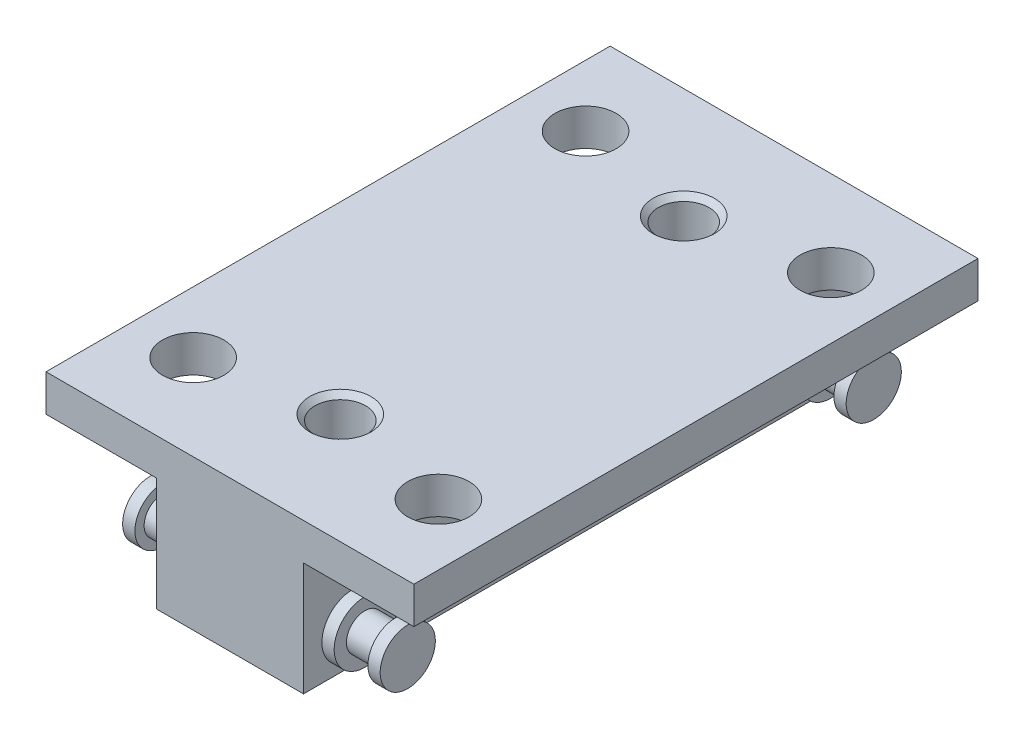
ISO-10303-21;
HEADER;
FILE_DESCRIPTION(('STEP AP214'),'2;1');
FILE_NAME('part.step','',(''),(''),'','','');
FILE_SCHEMA(('AUTOMOTIVE_DESIGN { 1 0 10303 214 1 1 1 1 }'));
ENDSEC;
DATA;
#1=APPLICATION_CONTEXT('core data for automotive mechanical design processes');
#2=APPLICATION_PROTOCOL_DEFINITION('international standard','automotive_design',2000,#1);
#3=PRODUCT_CONTEXT('',#1,'mechanical');
#4=PRODUCT('Part','Part','',(#3));
#5=PRODUCT_RELATED_PRODUCT_CATEGORY('part','',(#4));
#6=PRODUCT_DEFINITION_FORMATION('','',#4);
#7=PRODUCT_DEFINITION_CONTEXT('part definition',#1,'design');
#8=PRODUCT_DEFINITION('design','',#6,#7);
#9=PRODUCT_DEFINITION_SHAPE('','',#8);
#10=(LENGTH_UNIT() NAMED_UNIT(*) SI_UNIT(.MILLI.,.METRE.));
#11=(NAMED_UNIT(*) PLANE_ANGLE_UNIT() SI_UNIT($,.RADIAN.));
#12=(NAMED_UNIT(*) SI_UNIT($,.STERADIAN.) SOLID_ANGLE_UNIT());
#13=UNCERTAINTY_MEASURE_WITH_UNIT(LENGTH_MEASURE(1.E-05),#10,'distance_accuracy_value','');
#14=(GEOMETRIC_REPRESENTATION_CONTEXT(3) GLOBAL_UNCERTAINTY_ASSIGNED_CONTEXT((#13)) GLOBAL_UNIT_ASSIGNED_CONTEXT((#10,
#11,#12)) REPRESENTATION_CONTEXT('',''));
#15=CARTESIAN_POINT('',(0.,0.,0.));
#16=DIRECTION('',(0.,0.,1.));
#17=DIRECTION('',(1.,0.,0.));
#18=AXIS2_PLACEMENT_3D('',#15,#16,#17);
#19=CARTESIAN_POINT('',(15.,6.25,23.));
#20=DIRECTION('',(0.,-1.,0.));
#21=DIRECTION('',(0.,0.,-1.));
#22=AXIS2_PLACEMENT_3D('',#19,#20,#21);
#23=PLANE('',#22);
#24=CARTESIAN_POINT('',(10.,6.25,16.));
#25=DIRECTION('',(0.,1.,0.));
#26=DIRECTION('',(0.,0.,1.));
#27=AXIS2_PLACEMENT_3D('',#24,#25,#26);
#28=CIRCLE('',#27,2.5);
#29=CARTESIAN_POINT('',(10.,6.25,18.5));
#30=VERTEX_POINT('',#29);
#31=EDGE_CURVE('E206',#30,#30,#28,.T.);
#32=ORIENTED_EDGE('',*,*,#31,.F.);
#33=EDGE_LOOP('',(#32));
#34=FACE_BOUND('',#33,.T.);
#35=CARTESIAN_POINT('',(-10.,6.25,16.));
#36=DIRECTION('',(0.,1.,0.));
#37=DIRECTION('',(0.,0.,1.));
#38=AXIS2_PLACEMENT_3D('',#35,#36,#37);
#39=CIRCLE('',#38,2.5);
#40=CARTESIAN_POINT('',(-10.,6.25,18.5));
#41=VERTEX_POINT('',#40);
#42=EDGE_CURVE('E210',#41,#41,#39,.T.);
#43=ORIENTED_EDGE('',*,*,#42,.F.);
#44=EDGE_LOOP('',(#43));
#45=FACE_BOUND('',#44,.T.);
#46=CARTESIAN_POINT('',(10.,6.25,-16.));
#47=DIRECTION('',(0.,1.,0.));
#48=DIRECTION('',(0.,0.,1.));
#49=AXIS2_PLACEMENT_3D('',#46,#47,#48);
#50=CIRCLE('',#49,2.5);
#51=CARTESIAN_POINT('',(10.,6.25,-13.5));
#52=VERTEX_POINT('',#51);
#53=EDGE_CURVE('E214',#52,#52,#50,.T.);
#54=ORIENTED_EDGE('',*,*,#53,.F.);
#55=EDGE_LOOP('',(#54));
#56=FACE_BOUND('',#55,.T.);
#57=CARTESIAN_POINT('',(-10.,6.25,-16.));
#58=DIRECTION('',(0.,1.,0.));
#59=DIRECTION('',(0.,0.,1.));
#60=AXIS2_PLACEMENT_3D('',#57,#58,#59);
#61=CIRCLE('',#60,2.5);
#62=CARTESIAN_POINT('',(-10.,6.25,-13.5));
#63=VERTEX_POINT('',#62);
#64=EDGE_CURVE('E218',#63,#63,#61,.T.);
#65=ORIENTED_EDGE('',*,*,#64,.F.);
#66=EDGE_LOOP('',(#65));
#67=FACE_BOUND('',#66,.T.);
#68=CARTESIAN_POINT('',(0.,6.25,14.));
#69=DIRECTION('',(0.,1.,0.));
#70=DIRECTION('',(0.,0.,1.));
#71=AXIS2_PLACEMENT_3D('',#68,#69,#70);
#72=CIRCLE('',#71,2.5);
#73=CARTESIAN_POINT('',(0.,6.25,16.5));
#74=VERTEX_POINT('',#73);
#75=EDGE_CURVE('E221',#74,#74,#72,.T.);
#76=ORIENTED_EDGE('',*,*,#75,.F.);
#77=EDGE_LOOP('',(#76));
#78=FACE_BOUND('',#77,.T.);
#79=DIRECTION('',(0.,0.,-1.));
#80=VECTOR('',#79,1.);
#81=CARTESIAN_POINT('',(15.,6.25,23.));
#82=LINE('',#81,#80);
#83=CARTESIAN_POINT('',(15.,6.25,23.));
#84=VERTEX_POINT('',#83);
#85=CARTESIAN_POINT('',(15.,6.25,-23.));
#86=VERTEX_POINT('',#85);
#87=EDGE_CURVE('E122',#84,#86,#82,.T.);
#88=ORIENTED_EDGE('',*,*,#87,.T.);
#89=DIRECTION('',(-1.,0.,0.));
#90=VECTOR('',#89,1.);
#91=CARTESIAN_POINT('',(15.,6.25,-23.));
#92=LINE('',#91,#90);
#93=CARTESIAN_POINT('',(-15.,6.25,-23.));
#94=VERTEX_POINT('',#93);
#95=EDGE_CURVE('E115',#86,#94,#92,.T.);
#96=ORIENTED_EDGE('',*,*,#95,.T.);
#97=DIRECTION('',(0.,0.,-1.));
#98=VECTOR('',#97,1.);
#99=CARTESIAN_POINT('',(-15.,6.25,23.));
#100=LINE('',#99,#98);
#101=CARTESIAN_POINT('',(-15.,6.25,23.));
#102=VERTEX_POINT('',#101);
#103=EDGE_CURVE('E98',#102,#94,#100,.T.);
#104=ORIENTED_EDGE('',*,*,#103,.F.);
#105=DIRECTION('',(-1.,0.,0.));
#106=VECTOR('',#105,1.);
#107=CARTESIAN_POINT('',(15.,6.25,23.));
#108=LINE('',#107,#106);
#109=EDGE_CURVE('E145',#84,#102,#108,.T.);
#110=ORIENTED_EDGE('',*,*,#109,.F.);
#111=EDGE_LOOP('',(#88,#96,#104,#110));
#112=FACE_BOUND('',#111,.T.);
#113=CARTESIAN_POINT('',(0.,6.25,-14.));
#114=DIRECTION('',(0.,1.,0.));
#115=DIRECTION('',(0.,0.,1.));
#116=AXIS2_PLACEMENT_3D('',#113,#114,#115);
#117=CIRCLE('',#116,2.5);
#118=CARTESIAN_POINT('',(0.,6.25,-11.5));
#119=VERTEX_POINT('',#118);
#120=EDGE_CURVE('E657',#119,#119,#117,.T.);
#121=ORIENTED_EDGE('',*,*,#120,.F.);
#122=EDGE_LOOP('',(#121));
#123=FACE_BOUND('',#122,.T.);
#124=ADVANCED_FACE('F34',(#34,#45,#56,#67,#78,#112,#123),#23,.F.);
#125=CARTESIAN_POINT('',(-6.,-6.,23.));
#126=DIRECTION('',(0.,1.,0.));
#127=DIRECTION('',(0.,0.,1.));
#128=AXIS2_PLACEMENT_3D('',#125,#126,#127);
#129=PLANE('',#128);
#130=CARTESIAN_POINT('',(0.,-6.,14.));
#131=DIRECTION('',(0.,1.,0.));
#132=DIRECTION('',(0.,0.,1.));
#133=AXIS2_PLACEMENT_3D('',#130,#131,#132);
#134=CIRCLE('',#133,2.5);
#135=CARTESIAN_POINT('',(0.,-6.,16.5));
#136=VERTEX_POINT('',#135);
#137=EDGE_CURVE('E660',#136,#136,#134,.T.);
#138=ORIENTED_EDGE('',*,*,#137,.T.);
#139=EDGE_LOOP('',(#138));
#140=FACE_BOUND('',#139,.T.);
#141=DIRECTION('',(0.,0.,-1.));
#142=VECTOR('',#141,1.);
#143=CARTESIAN_POINT('',(-6.,-6.,23.));
#144=LINE('',#143,#142);
#145=CARTESIAN_POINT('',(-6.,-6.,23.));
#146=VERTEX_POINT('',#145);
#147=CARTESIAN_POINT('',(-6.,-6.,-23.));
#148=VERTEX_POINT('',#147);
#149=EDGE_CURVE('E165',#146,#148,#144,.T.);
#150=ORIENTED_EDGE('',*,*,#149,.T.);
#151=DIRECTION('',(1.,0.,0.));
#152=VECTOR('',#151,1.);
#153=CARTESIAN_POINT('',(-6.,-6.,-23.));
#154=LINE('',#153,#152);
#155=CARTESIAN_POINT('',(6.,-6.,-23.));
#156=VERTEX_POINT('',#155);
#157=EDGE_CURVE('E134',#148,#156,#154,.T.);
#158=ORIENTED_EDGE('',*,*,#157,.T.);
#159=DIRECTION('',(0.,0.,-1.));
#160=VECTOR('',#159,1.);
#161=CARTESIAN_POINT('',(6.,-6.,23.));
#162=LINE('',#161,#160);
#163=CARTESIAN_POINT('',(6.,-6.,23.));
#164=VERTEX_POINT('',#163);
#165=EDGE_CURVE('E163',#164,#156,#162,.T.);
#166=ORIENTED_EDGE('',*,*,#165,.F.);
#167=DIRECTION('',(1.,0.,0.));
#168=VECTOR('',#167,1.);
#169=CARTESIAN_POINT('',(-6.,-6.,23.));
#170=LINE('',#169,#168);
#171=EDGE_CURVE('E152',#146,#164,#170,.T.);
#172=ORIENTED_EDGE('',*,*,#171,.F.);
#173=EDGE_LOOP('',(#150,#158,#166,#172));
#174=FACE_BOUND('',#173,.T.);
#175=CARTESIAN_POINT('',(0.,-6.,-14.));
#176=DIRECTION('',(0.,1.,0.));
#177=DIRECTION('',(0.,0.,1.));
#178=AXIS2_PLACEMENT_3D('',#175,#176,#177);
#179=CIRCLE('',#178,2.5);
#180=CARTESIAN_POINT('',(0.,-6.,-11.5));
#181=VERTEX_POINT('',#180);
#182=EDGE_CURVE('E648',#181,#181,#179,.T.);
#183=ORIENTED_EDGE('',*,*,#182,.T.);
#184=EDGE_LOOP('',(#183));
#185=FACE_BOUND('',#184,.T.);
#186=ADVANCED_FACE('F189',(#140,#174,#185),#129,.F.);
#187=CARTESIAN_POINT('',(-6.,3.25,23.));
#188=DIRECTION('',(1.,0.,0.));
#189=DIRECTION('',(0.,0.,-1.));
#190=AXIS2_PLACEMENT_3D('',#187,#188,#189);
#191=PLANE('',#190);
#192=CARTESIAN_POINT('',(-6.,-3.125,19.));
#193=DIRECTION('',(1.,0.,0.));
#194=DIRECTION('',(0.,0.,-1.));
#195=AXIS2_PLACEMENT_3D('',#192,#193,#194);
#196=CIRCLE('',#195,2.5);
#197=CARTESIAN_POINT('',(-6.,-3.125,16.5));
#198=VERTEX_POINT('',#197);
#199=EDGE_CURVE('E172',#198,#198,#196,.F.);
#200=ORIENTED_EDGE('',*,*,#199,.F.);
#201=EDGE_LOOP('',(#200));
#202=FACE_BOUND('',#201,.T.);
#203=DIRECTION('',(0.,0.,-1.));
#204=VECTOR('',#203,1.);
#205=CARTESIAN_POINT('',(-6.,3.25,23.));
#206=LINE('',#205,#204);
#207=CARTESIAN_POINT('',(-6.,3.25,23.));
#208=VERTEX_POINT('',#207);
#209=CARTESIAN_POINT('',(-6.,3.25,-23.));
#210=VERTEX_POINT('',#209);
#211=EDGE_CURVE('E167',#208,#210,#206,.T.);
#212=ORIENTED_EDGE('',*,*,#211,.T.);
#213=DIRECTION('',(0.,-1.,0.));
#214=VECTOR('',#213,1.);
#215=CARTESIAN_POINT('',(-6.,3.25,-23.));
#216=LINE('',#215,#214);
#217=EDGE_CURVE('E131',#210,#148,#216,.T.);
#218=ORIENTED_EDGE('',*,*,#217,.T.);
#219=ORIENTED_EDGE('',*,*,#149,.F.);
#220=DIRECTION('',(0.,-1.,0.));
#221=VECTOR('',#220,1.);
#222=CARTESIAN_POINT('',(-6.,3.25,23.));
#223=LINE('',#222,#221);
#224=EDGE_CURVE('E150',#208,#146,#223,.T.);
#225=ORIENTED_EDGE('',*,*,#224,.F.);
#226=EDGE_LOOP('',(#212,#218,#219,#225));
#227=FACE_BOUND('',#226,.T.);
#228=CARTESIAN_POINT('',(-6.,-3.125,-19.));
#229=DIRECTION('',(1.,0.,0.));
#230=DIRECTION('',(0.,0.,-1.));
#231=AXIS2_PLACEMENT_3D('',#228,#229,#230);
#232=CIRCLE('',#231,2.5);
#233=CARTESIAN_POINT('',(-6.,-3.125,-21.5));
#234=VERTEX_POINT('',#233);
#235=EDGE_CURVE('E11',#234,#234,#232,.F.);
#236=ORIENTED_EDGE('',*,*,#235,.F.);
#237=EDGE_LOOP('',(#236));
#238=FACE_BOUND('',#237,.T.);
#239=ADVANCED_FACE('F181',(#202,#227,#238),#191,.F.);
#240=CARTESIAN_POINT('',(6.,-6.,23.));
#241=DIRECTION('',(-1.,0.,0.));
#242=DIRECTION('',(0.,0.,1.));
#243=AXIS2_PLACEMENT_3D('',#240,#241,#242);
#244=PLANE('',#243);
#245=ORIENTED_EDGE('',*,*,#165,.T.);
#246=DIRECTION('',(0.,1.,0.));
#247=VECTOR('',#246,1.);
#248=CARTESIAN_POINT('',(6.,-6.,-23.));
#249=LINE('',#248,#247);
#250=CARTESIAN_POINT('',(6.,3.25,-23.));
#251=VERTEX_POINT('',#250);
#252=EDGE_CURVE('E137',#156,#251,#249,.T.);
#253=ORIENTED_EDGE('',*,*,#252,.T.);
#254=DIRECTION('',(0.,0.,-1.));
#255=VECTOR('',#254,1.);
#256=CARTESIAN_POINT('',(6.,3.25,23.));
#257=LINE('',#256,#255);
#258=CARTESIAN_POINT('',(6.,3.25,23.));
#259=VERTEX_POINT('',#258);
#260=EDGE_CURVE('E161',#259,#251,#257,.T.);
#261=ORIENTED_EDGE('',*,*,#260,.F.);
#262=DIRECTION('',(0.,1.,0.));
#263=VECTOR('',#262,1.);
#264=CARTESIAN_POINT('',(6.,-6.,23.));
#265=LINE('',#264,#263);
#266=EDGE_CURVE('E154',#164,#259,#265,.T.);
#267=ORIENTED_EDGE('',*,*,#266,.F.);
#268=EDGE_LOOP('',(#245,#253,#261,#267));
#269=FACE_BOUND('',#268,.T.);
#270=CARTESIAN_POINT('',(6.,-3.125,19.));
#271=DIRECTION('',(-1.,0.,0.));
#272=DIRECTION('',(0.,0.,1.));
#273=AXIS2_PLACEMENT_3D('',#270,#271,#272);
#274=CIRCLE('',#273,2.5);
#275=CARTESIAN_POINT('',(6.,-3.125,21.5));
#276=VERTEX_POINT('',#275);
#277=EDGE_CURVE('E107',#276,#276,#274,.F.);
#278=ORIENTED_EDGE('',*,*,#277,.F.);
#279=EDGE_LOOP('',(#278));
#280=FACE_BOUND('',#279,.T.);
#281=CARTESIAN_POINT('',(6.,-3.125,-19.));
#282=DIRECTION('',(-1.,0.,0.));
#283=DIRECTION('',(0.,0.,1.));
#284=AXIS2_PLACEMENT_3D('',#281,#282,#283);
#285=CIRCLE('',#284,2.5);
#286=CARTESIAN_POINT('',(6.,-3.125,-16.5));
#287=VERTEX_POINT('',#286);
#288=EDGE_CURVE('E41',#287,#287,#285,.F.);
#289=ORIENTED_EDGE('',*,*,#288,.F.);
#290=EDGE_LOOP('',(#289));
#291=FACE_BOUND('',#290,.T.);
#292=ADVANCED_FACE('F179',(#269,#280,#291),#244,.F.);
#293=CARTESIAN_POINT('',(-15.,6.25,23.));
#294=DIRECTION('',(1.,0.,0.));
#295=DIRECTION('',(0.,0.,-1.));
#296=AXIS2_PLACEMENT_3D('',#293,#294,#295);
#297=PLANE('',#296);
#298=ORIENTED_EDGE('',*,*,#103,.T.);
#299=DIRECTION('',(0.,-1.,0.));
#300=VECTOR('',#299,1.);
#301=CARTESIAN_POINT('',(-15.,6.25,-23.));
#302=LINE('',#301,#300);
#303=CARTESIAN_POINT('',(-15.,3.25,-23.));
#304=VERTEX_POINT('',#303);
#305=EDGE_CURVE('E102',#94,#304,#302,.T.);
#306=ORIENTED_EDGE('',*,*,#305,.T.);
#307=DIRECTION('',(0.,0.,-1.));
#308=VECTOR('',#307,1.);
#309=CARTESIAN_POINT('',(-15.,3.25,23.));
#310=LINE('',#309,#308);
#311=CARTESIAN_POINT('',(-15.,3.25,23.));
#312=VERTEX_POINT('',#311);
#313=EDGE_CURVE('E108',#312,#304,#310,.T.);
#314=ORIENTED_EDGE('',*,*,#313,.F.);
#315=DIRECTION('',(0.,-1.,0.));
#316=VECTOR('',#315,1.);
#317=CARTESIAN_POINT('',(-15.,6.25,23.));
#318=LINE('',#317,#316);
#319=EDGE_CURVE('E103',#102,#312,#318,.T.);
#320=ORIENTED_EDGE('',*,*,#319,.F.);
#321=EDGE_LOOP('',(#298,#306,#314,#320));
#322=FACE_BOUND('',#321,.T.);
#323=ADVANCED_FACE('F100',(#322),#297,.F.);
#324=CARTESIAN_POINT('',(-15.,3.25,23.));
#325=DIRECTION('',(0.,1.,0.));
#326=DIRECTION('',(0.,0.,1.));
#327=AXIS2_PLACEMENT_3D('',#324,#325,#326);
#328=PLANE('',#327);
#329=CARTESIAN_POINT('',(-10.,3.25,16.));
#330=DIRECTION('',(0.,1.,0.));
#331=DIRECTION('',(0.,0.,1.));
#332=AXIS2_PLACEMENT_3D('',#329,#330,#331);
#333=CIRCLE('',#332,2.5);
#334=CARTESIAN_POINT('',(-10.,3.25,18.5));
#335=VERTEX_POINT('',#334);
#336=EDGE_CURVE('E639',#335,#335,#333,.F.);
#337=ORIENTED_EDGE('',*,*,#336,.F.);
#338=EDGE_LOOP('',(#337));
#339=FACE_BOUND('',#338,.T.);
#340=CARTESIAN_POINT('',(-10.,3.25,-16.));
#341=DIRECTION('',(0.,1.,0.));
#342=DIRECTION('',(0.,0.,1.));
#343=AXIS2_PLACEMENT_3D('',#340,#341,#342);
#344=CIRCLE('',#343,2.5);
#345=CARTESIAN_POINT('',(-10.,3.25,-13.5));
#346=VERTEX_POINT('',#345);
#347=EDGE_CURVE('E645',#346,#346,#344,.F.);
#348=ORIENTED_EDGE('',*,*,#347,.F.);
#349=EDGE_LOOP('',(#348));
#350=FACE_BOUND('',#349,.T.);
#351=ORIENTED_EDGE('',*,*,#313,.T.);
#352=DIRECTION('',(1.,0.,0.));
#353=VECTOR('',#352,1.);
#354=CARTESIAN_POINT('',(-15.,3.25,-23.));
#355=LINE('',#354,#353);
#356=EDGE_CURVE('E119',#304,#210,#355,.T.);
#357=ORIENTED_EDGE('',*,*,#356,.T.);
#358=ORIENTED_EDGE('',*,*,#211,.F.);
#359=DIRECTION('',(1.,0.,0.));
#360=VECTOR('',#359,1.);
#361=CARTESIAN_POINT('',(-15.,3.25,23.));
#362=LINE('',#361,#360);
#363=EDGE_CURVE('E148',#312,#208,#362,.T.);
#364=ORIENTED_EDGE('',*,*,#363,.F.);
#365=EDGE_LOOP('',(#351,#357,#358,#364));
#366=FACE_BOUND('',#365,.T.);
#367=ADVANCED_FACE('F188',(#339,#350,#366),#328,.F.);
#368=CARTESIAN_POINT('',(6.,3.25,23.));
#369=DIRECTION('',(0.,1.,0.));
#370=DIRECTION('',(0.,0.,1.));
#371=AXIS2_PLACEMENT_3D('',#368,#369,#370);
#372=PLANE('',#371);
#373=CARTESIAN_POINT('',(10.,3.25,16.));
#374=DIRECTION('',(0.,1.,0.));
#375=DIRECTION('',(0.,0.,1.));
#376=AXIS2_PLACEMENT_3D('',#373,#374,#375);
#377=CIRCLE('',#376,2.5);
#378=CARTESIAN_POINT('',(10.,3.25,18.5));
#379=VERTEX_POINT('',#378);
#380=EDGE_CURVE('E346',#379,#379,#377,.F.);
#381=ORIENTED_EDGE('',*,*,#380,.F.);
#382=EDGE_LOOP('',(#381));
#383=FACE_BOUND('',#382,.T.);
#384=CARTESIAN_POINT('',(10.,3.25,-16.));
#385=DIRECTION('',(0.,1.,0.));
#386=DIRECTION('',(0.,0.,1.));
#387=AXIS2_PLACEMENT_3D('',#384,#385,#386);
#388=CIRCLE('',#387,2.5);
#389=CARTESIAN_POINT('',(10.,3.25,-13.5));
#390=VERTEX_POINT('',#389);
#391=EDGE_CURVE('E350',#390,#390,#388,.F.);
#392=ORIENTED_EDGE('',*,*,#391,.F.);
#393=EDGE_LOOP('',(#392));
#394=FACE_BOUND('',#393,.T.);
#395=ORIENTED_EDGE('',*,*,#260,.T.);
#396=DIRECTION('',(1.,0.,0.));
#397=VECTOR('',#396,1.);
#398=CARTESIAN_POINT('',(6.,3.25,-23.));
#399=LINE('',#398,#397);
#400=CARTESIAN_POINT('',(15.,3.25,-23.));
#401=VERTEX_POINT('',#400);
#402=EDGE_CURVE('E140',#251,#401,#399,.T.);
#403=ORIENTED_EDGE('',*,*,#402,.T.);
#404=DIRECTION('',(0.,0.,-1.));
#405=VECTOR('',#404,1.);
#406=CARTESIAN_POINT('',(15.,3.25,23.));
#407=LINE('',#406,#405);
#408=CARTESIAN_POINT('',(15.,3.25,23.));
#409=VERTEX_POINT('',#408);
#410=EDGE_CURVE('E159',#409,#401,#407,.T.);
#411=ORIENTED_EDGE('',*,*,#410,.F.);
#412=DIRECTION('',(1.,0.,0.));
#413=VECTOR('',#412,1.);
#414=CARTESIAN_POINT('',(6.,3.25,23.));
#415=LINE('',#414,#413);
#416=EDGE_CURVE('E53',#259,#409,#415,.T.);
#417=ORIENTED_EDGE('',*,*,#416,.F.);
#418=EDGE_LOOP('',(#395,#403,#411,#417));
#419=FACE_BOUND('',#418,.T.);
#420=ADVANCED_FACE('F334',(#383,#394,#419),#372,.F.);
#421=CARTESIAN_POINT('',(15.,3.25,23.));
#422=DIRECTION('',(-1.,0.,0.));
#423=DIRECTION('',(0.,0.,1.));
#424=AXIS2_PLACEMENT_3D('',#421,#422,#423);
#425=PLANE('',#424);
#426=ORIENTED_EDGE('',*,*,#410,.T.);
#427=DIRECTION('',(0.,1.,0.));
#428=VECTOR('',#427,1.);
#429=CARTESIAN_POINT('',(15.,3.25,-23.));
#430=LINE('',#429,#428);
#431=EDGE_CURVE('E143',#401,#86,#430,.T.);
#432=ORIENTED_EDGE('',*,*,#431,.T.);
#433=ORIENTED_EDGE('',*,*,#87,.F.);
#434=DIRECTION('',(0.,1.,0.));
#435=VECTOR('',#434,1.);
#436=CARTESIAN_POINT('',(15.,3.25,23.));
#437=LINE('',#436,#435);
#438=EDGE_CURVE('E48',#409,#84,#437,.T.);
#439=ORIENTED_EDGE('',*,*,#438,.F.);
#440=EDGE_LOOP('',(#426,#432,#433,#439));
#441=FACE_BOUND('',#440,.T.);
#442=ADVANCED_FACE('F332',(#441),#425,.F.);
#443=CARTESIAN_POINT('',(0.,0.,23.));
#444=DIRECTION('',(0.,0.,1.));
#445=DIRECTION('',(1.,0.,0.));
#446=AXIS2_PLACEMENT_3D('',#443,#444,#445);
#447=PLANE('',#446);
#448=ORIENTED_EDGE('',*,*,#109,.T.);
#449=ORIENTED_EDGE('',*,*,#319,.T.);
#450=ORIENTED_EDGE('',*,*,#363,.T.);
#451=ORIENTED_EDGE('',*,*,#224,.T.);
#452=ORIENTED_EDGE('',*,*,#171,.T.);
#453=ORIENTED_EDGE('',*,*,#266,.T.);
#454=ORIENTED_EDGE('',*,*,#416,.T.);
#455=ORIENTED_EDGE('',*,*,#438,.T.);
#456=EDGE_LOOP('',(#448,#449,#450,#451,#452,#453,#454,#455));
#457=FACE_BOUND('',#456,.T.);
#458=ADVANCED_FACE('F329',(#457),#447,.T.);
#459=CARTESIAN_POINT('',(0.,0.,-23.));
#460=DIRECTION('',(0.,0.,1.));
#461=DIRECTION('',(1.,0.,0.));
#462=AXIS2_PLACEMENT_3D('',#459,#460,#461);
#463=PLANE('',#462);
#464=ORIENTED_EDGE('',*,*,#95,.F.);
#465=ORIENTED_EDGE('',*,*,#431,.F.);
#466=ORIENTED_EDGE('',*,*,#402,.F.);
#467=ORIENTED_EDGE('',*,*,#252,.F.);
#468=ORIENTED_EDGE('',*,*,#157,.F.);
#469=ORIENTED_EDGE('',*,*,#217,.F.);
#470=ORIENTED_EDGE('',*,*,#356,.F.);
#471=ORIENTED_EDGE('',*,*,#305,.F.);
#472=EDGE_LOOP('',(#464,#465,#466,#467,#468,#469,#470,#471));
#473=FACE_BOUND('',#472,.T.);
#474=ADVANCED_FACE('F113',(#473),#463,.F.);
#475=CARTESIAN_POINT('',(10.5,-3.125,19.));
#476=DIRECTION('',(-1.,0.,0.));
#477=DIRECTION('',(0.,0.,1.));
#478=AXIS2_PLACEMENT_3D('',#475,#476,#477);
#479=PLANE('',#478);
#480=CARTESIAN_POINT('',(10.5,-3.125,19.));
#481=DIRECTION('',(1.,0.,0.));
#482=DIRECTION('',(0.,0.,-1.));
#483=AXIS2_PLACEMENT_3D('',#480,#481,#482);
#484=CIRCLE('',#483,2.25);
#485=CARTESIAN_POINT('',(10.5,-3.125,16.75));
#486=VERTEX_POINT('',#485);
#487=EDGE_CURVE('E123',#486,#486,#484,.T.);
#488=ORIENTED_EDGE('',*,*,#487,.T.);
#489=EDGE_LOOP('',(#488));
#490=FACE_BOUND('',#489,.T.);
#491=ADVANCED_FACE('F322',(#490),#479,.F.);
#492=CARTESIAN_POINT('',(-10.5,-3.125,19.));
#493=DIRECTION('',(1.,0.,0.));
#494=DIRECTION('',(0.,0.,-1.));
#495=AXIS2_PLACEMENT_3D('',#492,#493,#494);
#496=CYLINDRICAL_SURFACE('',#495,2.25);
#497=ORIENTED_EDGE('',*,*,#487,.F.);
#498=EDGE_LOOP('',(#497));
#499=FACE_BOUND('',#498,.T.);
#500=CARTESIAN_POINT('',(9.5,-3.125,19.));
#501=DIRECTION('',(1.,0.,0.));
#502=DIRECTION('',(0.,0.,-1.));
#503=AXIS2_PLACEMENT_3D('',#500,#501,#502);
#504=CIRCLE('',#503,2.25);
#505=CARTESIAN_POINT('',(9.5,-3.125,16.75));
#506=VERTEX_POINT('',#505);
#507=EDGE_CURVE('E126',#506,#506,#504,.T.);
#508=ORIENTED_EDGE('',*,*,#507,.T.);
#509=EDGE_LOOP('',(#508));
#510=FACE_BOUND('',#509,.T.);
#511=ADVANCED_FACE('F286',(#499,#510),#496,.T.);
#512=CARTESIAN_POINT('',(9.5,-5.375,19.));
#513=DIRECTION('',(1.,0.,0.));
#514=DIRECTION('',(0.,0.,-1.));
#515=AXIS2_PLACEMENT_3D('',#512,#513,#514);
#516=PLANE('',#515);
#517=ORIENTED_EDGE('',*,*,#507,.F.);
#518=EDGE_LOOP('',(#517));
#519=FACE_BOUND('',#518,.T.);
#520=CARTESIAN_POINT('',(9.5,-3.125,19.));
#521=DIRECTION('',(1.,0.,0.));
#522=DIRECTION('',(0.,0.,-1.));
#523=AXIS2_PLACEMENT_3D('',#520,#521,#522);
#524=CIRCLE('',#523,1.5);
#525=CARTESIAN_POINT('',(9.5,-3.125,17.5));
#526=VERTEX_POINT('',#525);
#527=EDGE_CURVE('E281',#526,#526,#524,.T.);
#528=ORIENTED_EDGE('',*,*,#527,.T.);
#529=EDGE_LOOP('',(#528));
#530=FACE_BOUND('',#529,.T.);
#531=ADVANCED_FACE('F288',(#519,#530),#516,.F.);
#532=CARTESIAN_POINT('',(-10.5,-3.125,19.));
#533=DIRECTION('',(1.,0.,0.));
#534=DIRECTION('',(0.,0.,-1.));
#535=AXIS2_PLACEMENT_3D('',#532,#533,#534);
#536=CYLINDRICAL_SURFACE('',#535,1.5);
#537=ORIENTED_EDGE('',*,*,#527,.F.);
#538=EDGE_LOOP('',(#537));
#539=FACE_BOUND('',#538,.T.);
#540=CARTESIAN_POINT('',(7.,-3.125,19.));
#541=DIRECTION('',(1.,0.,0.));
#542=DIRECTION('',(0.,0.,-1.));
#543=AXIS2_PLACEMENT_3D('',#540,#541,#542);
#544=CIRCLE('',#543,1.5);
#545=CARTESIAN_POINT('',(7.,-3.125,17.5));
#546=VERTEX_POINT('',#545);
#547=EDGE_CURVE('E278',#546,#546,#544,.T.);
#548=ORIENTED_EDGE('',*,*,#547,.T.);
#549=EDGE_LOOP('',(#548));
#550=FACE_BOUND('',#549,.T.);
#551=ADVANCED_FACE('F291',(#539,#550),#536,.T.);
#552=CARTESIAN_POINT('',(7.,-4.625,19.));
#553=DIRECTION('',(-1.,0.,0.));
#554=DIRECTION('',(0.,0.,1.));
#555=AXIS2_PLACEMENT_3D('',#552,#553,#554);
#556=PLANE('',#555);
#557=ORIENTED_EDGE('',*,*,#547,.F.);
#558=EDGE_LOOP('',(#557));
#559=FACE_BOUND('',#558,.T.);
#560=CARTESIAN_POINT('',(7.,-3.125,19.));
#561=DIRECTION('',(1.,0.,0.));
#562=DIRECTION('',(0.,0.,-1.));
#563=AXIS2_PLACEMENT_3D('',#560,#561,#562);
#564=CIRCLE('',#563,2.5);
#565=CARTESIAN_POINT('',(7.,-3.125,16.5));
#566=VERTEX_POINT('',#565);
#567=EDGE_CURVE('E275',#566,#566,#564,.T.);
#568=ORIENTED_EDGE('',*,*,#567,.T.);
#569=EDGE_LOOP('',(#568));
#570=FACE_BOUND('',#569,.T.);
#571=ADVANCED_FACE('F297',(#559,#570),#556,.F.);
#572=CARTESIAN_POINT('',(-10.5,-3.125,19.));
#573=DIRECTION('',(1.,0.,0.));
#574=DIRECTION('',(0.,0.,-1.));
#575=AXIS2_PLACEMENT_3D('',#572,#573,#574);
#576=CYLINDRICAL_SURFACE('',#575,2.5);
#577=ORIENTED_EDGE('',*,*,#567,.F.);
#578=EDGE_LOOP('',(#577));
#579=FACE_BOUND('',#578,.T.);
#580=ORIENTED_EDGE('',*,*,#277,.T.);
#581=EDGE_LOOP('',(#580));
#582=FACE_BOUND('',#581,.T.);
#583=ADVANCED_FACE('F303',(#579,#582),#576,.T.);
#584=CARTESIAN_POINT('',(-10.5,-3.125,19.));
#585=DIRECTION('',(1.,0.,0.));
#586=DIRECTION('',(0.,0.,-1.));
#587=AXIS2_PLACEMENT_3D('',#584,#585,#586);
#588=CYLINDRICAL_SURFACE('',#587,2.5);
#589=ORIENTED_EDGE('',*,*,#199,.T.);
#590=EDGE_LOOP('',(#589));
#591=FACE_BOUND('',#590,.T.);
#592=CARTESIAN_POINT('',(-7.,-3.125,19.));
#593=DIRECTION('',(1.,0.,0.));
#594=DIRECTION('',(0.,0.,-1.));
#595=AXIS2_PLACEMENT_3D('',#592,#593,#594);
#596=CIRCLE('',#595,2.5);
#597=CARTESIAN_POINT('',(-7.,-3.125,16.5));
#598=VERTEX_POINT('',#597);
#599=EDGE_CURVE('E272',#598,#598,#596,.T.);
#600=ORIENTED_EDGE('',*,*,#599,.T.);
#601=EDGE_LOOP('',(#600));
#602=FACE_BOUND('',#601,.T.);
#603=ADVANCED_FACE('F309',(#591,#602),#588,.T.);
#604=CARTESIAN_POINT('',(-7.,-5.625,19.));
#605=DIRECTION('',(1.,0.,0.));
#606=DIRECTION('',(0.,0.,-1.));
#607=AXIS2_PLACEMENT_3D('',#604,#605,#606);
#608=PLANE('',#607);
#609=ORIENTED_EDGE('',*,*,#599,.F.);
#610=EDGE_LOOP('',(#609));
#611=FACE_BOUND('',#610,.T.);
#612=CARTESIAN_POINT('',(-7.,-3.125,19.));
#613=DIRECTION('',(1.,0.,0.));
#614=DIRECTION('',(0.,0.,-1.));
#615=AXIS2_PLACEMENT_3D('',#612,#613,#614);
#616=CIRCLE('',#615,1.5);
#617=CARTESIAN_POINT('',(-7.,-3.125,17.5));
#618=VERTEX_POINT('',#617);
#619=EDGE_CURVE('E269',#618,#618,#616,.T.);
#620=ORIENTED_EDGE('',*,*,#619,.T.);
#621=EDGE_LOOP('',(#620));
#622=FACE_BOUND('',#621,.T.);
#623=ADVANCED_FACE('F315',(#611,#622),#608,.F.);
#624=CARTESIAN_POINT('',(-10.5,-3.125,19.));
#625=DIRECTION('',(1.,0.,0.));
#626=DIRECTION('',(0.,0.,-1.));
#627=AXIS2_PLACEMENT_3D('',#624,#625,#626);
#628=CYLINDRICAL_SURFACE('',#627,1.5);
#629=ORIENTED_EDGE('',*,*,#619,.F.);
#630=EDGE_LOOP('',(#629));
#631=FACE_BOUND('',#630,.T.);
#632=CARTESIAN_POINT('',(-9.5,-3.125,19.));
#633=DIRECTION('',(1.,0.,0.));
#634=DIRECTION('',(0.,0.,-1.));
#635=AXIS2_PLACEMENT_3D('',#632,#633,#634);
#636=CIRCLE('',#635,1.5);
#637=CARTESIAN_POINT('',(-9.5,-3.125,17.5));
#638=VERTEX_POINT('',#637);
#639=EDGE_CURVE('E266',#638,#638,#636,.T.);
#640=ORIENTED_EDGE('',*,*,#639,.T.);
#641=EDGE_LOOP('',(#640));
#642=FACE_BOUND('',#641,.T.);
#643=ADVANCED_FACE('F444',(#631,#642),#628,.T.);
#644=CARTESIAN_POINT('',(-9.5,-4.625,19.));
#645=DIRECTION('',(-1.,0.,0.));
#646=DIRECTION('',(0.,0.,1.));
#647=AXIS2_PLACEMENT_3D('',#644,#645,#646);
#648=PLANE('',#647);
#649=ORIENTED_EDGE('',*,*,#639,.F.);
#650=EDGE_LOOP('',(#649));
#651=FACE_BOUND('',#650,.T.);
#652=CARTESIAN_POINT('',(-9.5,-3.125,19.));
#653=DIRECTION('',(1.,0.,0.));
#654=DIRECTION('',(0.,0.,-1.));
#655=AXIS2_PLACEMENT_3D('',#652,#653,#654);
#656=CIRCLE('',#655,2.25);
#657=CARTESIAN_POINT('',(-9.5,-3.125,16.75));
#658=VERTEX_POINT('',#657);
#659=EDGE_CURVE('E263',#658,#658,#656,.T.);
#660=ORIENTED_EDGE('',*,*,#659,.T.);
#661=EDGE_LOOP('',(#660));
#662=FACE_BOUND('',#661,.T.);
#663=ADVANCED_FACE('F440',(#651,#662),#648,.F.);
#664=CARTESIAN_POINT('',(-10.5,-3.125,19.));
#665=DIRECTION('',(1.,0.,0.));
#666=DIRECTION('',(0.,0.,-1.));
#667=AXIS2_PLACEMENT_3D('',#664,#665,#666);
#668=CYLINDRICAL_SURFACE('',#667,2.25);
#669=ORIENTED_EDGE('',*,*,#659,.F.);
#670=EDGE_LOOP('',(#669));
#671=FACE_BOUND('',#670,.T.);
#672=CARTESIAN_POINT('',(-10.5,-3.125,19.));
#673=DIRECTION('',(1.,0.,0.));
#674=DIRECTION('',(0.,0.,-1.));
#675=AXIS2_PLACEMENT_3D('',#672,#673,#674);
#676=CIRCLE('',#675,2.25);
#677=CARTESIAN_POINT('',(-10.5,-3.125,16.75));
#678=VERTEX_POINT('',#677);
#679=EDGE_CURVE('E260',#678,#678,#676,.T.);
#680=ORIENTED_EDGE('',*,*,#679,.T.);
#681=EDGE_LOOP('',(#680));
#682=FACE_BOUND('',#681,.T.);
#683=ADVANCED_FACE('F436',(#671,#682),#668,.T.);
#684=CARTESIAN_POINT('',(-10.5,-5.375,19.));
#685=DIRECTION('',(1.,0.,0.));
#686=DIRECTION('',(0.,0.,-1.));
#687=AXIS2_PLACEMENT_3D('',#684,#685,#686);
#688=PLANE('',#687);
#689=ORIENTED_EDGE('',*,*,#679,.F.);
#690=EDGE_LOOP('',(#689));
#691=FACE_BOUND('',#690,.T.);
#692=ADVANCED_FACE('F432',(#691),#688,.F.);
#693=CARTESIAN_POINT('',(10.5,-3.125,-19.));
#694=DIRECTION('',(-1.,0.,0.));
#695=DIRECTION('',(0.,0.,1.));
#696=AXIS2_PLACEMENT_3D('',#693,#694,#695);
#697=PLANE('',#696);
#698=CARTESIAN_POINT('',(10.5,-3.125,-19.));
#699=DIRECTION('',(1.,0.,0.));
#700=DIRECTION('',(0.,0.,-1.));
#701=AXIS2_PLACEMENT_3D('',#698,#699,#700);
#702=CIRCLE('',#701,2.25);
#703=CARTESIAN_POINT('',(10.5,-3.125,-21.25));
#704=VERTEX_POINT('',#703);
#705=EDGE_CURVE('E257',#704,#704,#702,.T.);
#706=ORIENTED_EDGE('',*,*,#705,.T.);
#707=EDGE_LOOP('',(#706));
#708=FACE_BOUND('',#707,.T.);
#709=ADVANCED_FACE('F428',(#708),#697,.F.);
#710=CARTESIAN_POINT('',(-10.5,-3.125,-19.));
#711=DIRECTION('',(1.,0.,0.));
#712=DIRECTION('',(0.,0.,-1.));
#713=AXIS2_PLACEMENT_3D('',#710,#711,#712);
#714=CYLINDRICAL_SURFACE('',#713,2.25);
#715=ORIENTED_EDGE('',*,*,#705,.F.);
#716=EDGE_LOOP('',(#715));
#717=FACE_BOUND('',#716,.T.);
#718=CARTESIAN_POINT('',(9.5,-3.125,-19.));
#719=DIRECTION('',(1.,0.,0.));
#720=DIRECTION('',(0.,0.,-1.));
#721=AXIS2_PLACEMENT_3D('',#718,#719,#720);
#722=CIRCLE('',#721,2.25);
#723=CARTESIAN_POINT('',(9.5,-3.125,-21.25));
#724=VERTEX_POINT('',#723);
#725=EDGE_CURVE('E254',#724,#724,#722,.T.);
#726=ORIENTED_EDGE('',*,*,#725,.T.);
#727=EDGE_LOOP('',(#726));
#728=FACE_BOUND('',#727,.T.);
#729=ADVANCED_FACE('F424',(#717,#728),#714,.T.);
#730=CARTESIAN_POINT('',(9.5,-5.375,-19.));
#731=DIRECTION('',(1.,0.,0.));
#732=DIRECTION('',(0.,0.,-1.));
#733=AXIS2_PLACEMENT_3D('',#730,#731,#732);
#734=PLANE('',#733);
#735=ORIENTED_EDGE('',*,*,#725,.F.);
#736=EDGE_LOOP('',(#735));
#737=FACE_BOUND('',#736,.T.);
#738=CARTESIAN_POINT('',(9.5,-3.125,-19.));
#739=DIRECTION('',(1.,0.,0.));
#740=DIRECTION('',(0.,0.,-1.));
#741=AXIS2_PLACEMENT_3D('',#738,#739,#740);
#742=CIRCLE('',#741,1.5);
#743=CARTESIAN_POINT('',(9.5,-3.125,-20.5));
#744=VERTEX_POINT('',#743);
#745=EDGE_CURVE('E251',#744,#744,#742,.T.);
#746=ORIENTED_EDGE('',*,*,#745,.T.);
#747=EDGE_LOOP('',(#746));
#748=FACE_BOUND('',#747,.T.);
#749=ADVANCED_FACE('F420',(#737,#748),#734,.F.);
#750=CARTESIAN_POINT('',(-10.5,-3.125,-19.));
#751=DIRECTION('',(1.,0.,0.));
#752=DIRECTION('',(0.,0.,-1.));
#753=AXIS2_PLACEMENT_3D('',#750,#751,#752);
#754=CYLINDRICAL_SURFACE('',#753,1.5);
#755=ORIENTED_EDGE('',*,*,#745,.F.);
#756=EDGE_LOOP('',(#755));
#757=FACE_BOUND('',#756,.T.);
#758=CARTESIAN_POINT('',(7.,-3.125,-19.));
#759=DIRECTION('',(1.,0.,0.));
#760=DIRECTION('',(0.,0.,-1.));
#761=AXIS2_PLACEMENT_3D('',#758,#759,#760);
#762=CIRCLE('',#761,1.5);
#763=CARTESIAN_POINT('',(7.,-3.125,-20.5));
#764=VERTEX_POINT('',#763);
#765=EDGE_CURVE('E248',#764,#764,#762,.T.);
#766=ORIENTED_EDGE('',*,*,#765,.T.);
#767=EDGE_LOOP('',(#766));
#768=FACE_BOUND('',#767,.T.);
#769=ADVANCED_FACE('F416',(#757,#768),#754,.T.);
#770=CARTESIAN_POINT('',(7.,-4.625,-19.));
#771=DIRECTION('',(-1.,0.,0.));
#772=DIRECTION('',(0.,0.,1.));
#773=AXIS2_PLACEMENT_3D('',#770,#771,#772);
#774=PLANE('',#773);
#775=ORIENTED_EDGE('',*,*,#765,.F.);
#776=EDGE_LOOP('',(#775));
#777=FACE_BOUND('',#776,.T.);
#778=CARTESIAN_POINT('',(7.,-3.125,-19.));
#779=DIRECTION('',(1.,0.,0.));
#780=DIRECTION('',(0.,0.,-1.));
#781=AXIS2_PLACEMENT_3D('',#778,#779,#780);
#782=CIRCLE('',#781,2.5);
#783=CARTESIAN_POINT('',(7.,-3.125,-21.5));
#784=VERTEX_POINT('',#783);
#785=EDGE_CURVE('E245',#784,#784,#782,.T.);
#786=ORIENTED_EDGE('',*,*,#785,.T.);
#787=EDGE_LOOP('',(#786));
#788=FACE_BOUND('',#787,.T.);
#789=ADVANCED_FACE('F412',(#777,#788),#774,.F.);
#790=CARTESIAN_POINT('',(-10.5,-3.125,-19.));
#791=DIRECTION('',(1.,0.,0.));
#792=DIRECTION('',(0.,0.,-1.));
#793=AXIS2_PLACEMENT_3D('',#790,#791,#792);
#794=CYLINDRICAL_SURFACE('',#793,2.5);
#795=ORIENTED_EDGE('',*,*,#785,.F.);
#796=EDGE_LOOP('',(#795));
#797=FACE_BOUND('',#796,.T.);
#798=ORIENTED_EDGE('',*,*,#288,.T.);
#799=EDGE_LOOP('',(#798));
#800=FACE_BOUND('',#799,.T.);
#801=ADVANCED_FACE('F177',(#797,#800),#794,.T.);
#802=CARTESIAN_POINT('',(-10.5,-3.125,-19.));
#803=DIRECTION('',(1.,0.,0.));
#804=DIRECTION('',(0.,0.,-1.));
#805=AXIS2_PLACEMENT_3D('',#802,#803,#804);
#806=CYLINDRICAL_SURFACE('',#805,2.5);
#807=ORIENTED_EDGE('',*,*,#235,.T.);
#808=EDGE_LOOP('',(#807));
#809=FACE_BOUND('',#808,.T.);
#810=CARTESIAN_POINT('',(-7.,-3.125,-19.));
#811=DIRECTION('',(1.,0.,0.));
#812=DIRECTION('',(0.,0.,-1.));
#813=AXIS2_PLACEMENT_3D('',#810,#811,#812);
#814=CIRCLE('',#813,2.5);
#815=CARTESIAN_POINT('',(-7.,-3.125,-21.5));
#816=VERTEX_POINT('',#815);
#817=EDGE_CURVE('E242',#816,#816,#814,.T.);
#818=ORIENTED_EDGE('',*,*,#817,.T.);
#819=EDGE_LOOP('',(#818));
#820=FACE_BOUND('',#819,.T.);
#821=ADVANCED_FACE('F369',(#809,#820),#806,.T.);
#822=CARTESIAN_POINT('',(-7.,-5.625,-19.));
#823=DIRECTION('',(1.,0.,0.));
#824=DIRECTION('',(0.,0.,-1.));
#825=AXIS2_PLACEMENT_3D('',#822,#823,#824);
#826=PLANE('',#825);
#827=ORIENTED_EDGE('',*,*,#817,.F.);
#828=EDGE_LOOP('',(#827));
#829=FACE_BOUND('',#828,.T.);
#830=CARTESIAN_POINT('',(-7.,-3.125,-19.));
#831=DIRECTION('',(1.,0.,0.));
#832=DIRECTION('',(0.,0.,-1.));
#833=AXIS2_PLACEMENT_3D('',#830,#831,#832);
#834=CIRCLE('',#833,1.5);
#835=CARTESIAN_POINT('',(-7.,-3.125,-20.5));
#836=VERTEX_POINT('',#835);
#837=EDGE_CURVE('E239',#836,#836,#834,.T.);
#838=ORIENTED_EDGE('',*,*,#837,.T.);
#839=EDGE_LOOP('',(#838));
#840=FACE_BOUND('',#839,.T.);
#841=ADVANCED_FACE('F372',(#829,#840),#826,.F.);
#842=CARTESIAN_POINT('',(-10.5,-3.125,-19.));
#843=DIRECTION('',(1.,0.,0.));
#844=DIRECTION('',(0.,0.,-1.));
#845=AXIS2_PLACEMENT_3D('',#842,#843,#844);
#846=CYLINDRICAL_SURFACE('',#845,1.5);
#847=ORIENTED_EDGE('',*,*,#837,.F.);
#848=EDGE_LOOP('',(#847));
#849=FACE_BOUND('',#848,.T.);
#850=CARTESIAN_POINT('',(-9.5,-3.125,-19.));
#851=DIRECTION('',(1.,0.,0.));
#852=DIRECTION('',(0.,0.,-1.));
#853=AXIS2_PLACEMENT_3D('',#850,#851,#852);
#854=CIRCLE('',#853,1.5);
#855=CARTESIAN_POINT('',(-9.5,-3.125,-20.5));
#856=VERTEX_POINT('',#855);
#857=EDGE_CURVE('E236',#856,#856,#854,.T.);
#858=ORIENTED_EDGE('',*,*,#857,.T.);
#859=EDGE_LOOP('',(#858));
#860=FACE_BOUND('',#859,.T.);
#861=ADVANCED_FACE('F378',(#849,#860),#846,.T.);
#862=CARTESIAN_POINT('',(-9.5,-4.625,-19.));
#863=DIRECTION('',(-1.,0.,0.));
#864=DIRECTION('',(0.,0.,1.));
#865=AXIS2_PLACEMENT_3D('',#862,#863,#864);
#866=PLANE('',#865);
#867=ORIENTED_EDGE('',*,*,#857,.F.);
#868=EDGE_LOOP('',(#867));
#869=FACE_BOUND('',#868,.T.);
#870=CARTESIAN_POINT('',(-9.5,-3.125,-19.));
#871=DIRECTION('',(1.,0.,0.));
#872=DIRECTION('',(0.,0.,-1.));
#873=AXIS2_PLACEMENT_3D('',#870,#871,#872);
#874=CIRCLE('',#873,2.25);
#875=CARTESIAN_POINT('',(-9.5,-3.125,-21.25));
#876=VERTEX_POINT('',#875);
#877=EDGE_CURVE('E227',#876,#876,#874,.T.);
#878=ORIENTED_EDGE('',*,*,#877,.T.);
#879=EDGE_LOOP('',(#878));
#880=FACE_BOUND('',#879,.T.);
#881=ADVANCED_FACE('F384',(#869,#880),#866,.F.);
#882=CARTESIAN_POINT('',(-10.5,-3.125,-19.));
#883=DIRECTION('',(1.,0.,0.));
#884=DIRECTION('',(0.,0.,-1.));
#885=AXIS2_PLACEMENT_3D('',#882,#883,#884);
#886=CYLINDRICAL_SURFACE('',#885,2.25);
#887=ORIENTED_EDGE('',*,*,#877,.F.);
#888=EDGE_LOOP('',(#887));
#889=FACE_BOUND('',#888,.T.);
#890=CARTESIAN_POINT('',(-10.5,-3.125,-19.));
#891=DIRECTION('',(1.,0.,0.));
#892=DIRECTION('',(0.,0.,-1.));
#893=AXIS2_PLACEMENT_3D('',#890,#891,#892);
#894=CIRCLE('',#893,2.25);
#895=CARTESIAN_POINT('',(-10.5,-3.125,-21.25));
#896=VERTEX_POINT('',#895);
#897=EDGE_CURVE('E223',#896,#896,#894,.T.);
#898=ORIENTED_EDGE('',*,*,#897,.T.);
#899=EDGE_LOOP('',(#898));
#900=FACE_BOUND('',#899,.T.);
#901=ADVANCED_FACE('F390',(#889,#900),#886,.T.);
#902=CARTESIAN_POINT('',(-10.5,-5.375,-19.));
#903=DIRECTION('',(1.,0.,0.));
#904=DIRECTION('',(0.,0.,-1.));
#905=AXIS2_PLACEMENT_3D('',#902,#903,#904);
#906=PLANE('',#905);
#907=ORIENTED_EDGE('',*,*,#897,.F.);
#908=EDGE_LOOP('',(#907));
#909=FACE_BOUND('',#908,.T.);
#910=ADVANCED_FACE('F396',(#909),#906,.F.);
#911=CARTESIAN_POINT('',(0.,5.817,14.));
#912=DIRECTION('',(0.,1.,0.));
#913=DIRECTION('',(0.,0.,1.));
#914=AXIS2_PLACEMENT_3D('',#911,#912,#913);
#915=CONICAL_SURFACE('',#914,2.067,0.785398163397448);
#916=ORIENTED_EDGE('',*,*,#75,.T.);
#917=EDGE_LOOP('',(#916));
#918=FACE_BOUND('',#917,.T.);
#919=CARTESIAN_POINT('',(0.,5.817,14.));
#920=DIRECTION('',(0.,1.,0.));
#921=DIRECTION('',(0.,0.,1.));
#922=AXIS2_PLACEMENT_3D('',#919,#920,#921);
#923=CIRCLE('',#922,2.067);
#924=CARTESIAN_POINT('',(0.,5.817,16.067));
#925=VERTEX_POINT('',#924);
#926=EDGE_CURVE('E224',#925,#925,#923,.T.);
#927=ORIENTED_EDGE('',*,*,#926,.F.);
#928=EDGE_LOOP('',(#927));
#929=FACE_BOUND('',#928,.T.);
#930=ADVANCED_FACE('F401',(#918,#929),#915,.F.);
#931=CARTESIAN_POINT('',(0.,-6.,14.));
#932=DIRECTION('',(0.,1.,0.));
#933=DIRECTION('',(0.,0.,1.));
#934=AXIS2_PLACEMENT_3D('',#931,#932,#933);
#935=CYLINDRICAL_SURFACE('',#934,2.067);
#936=ORIENTED_EDGE('',*,*,#926,.T.);
#937=EDGE_LOOP('',(#936));
#938=FACE_BOUND('',#937,.T.);
#939=CARTESIAN_POINT('',(0.,-5.567,14.));
#940=DIRECTION('',(0.,1.,0.));
#941=DIRECTION('',(0.,0.,1.));
#942=AXIS2_PLACEMENT_3D('',#939,#940,#941);
#943=CIRCLE('',#942,2.067);
#944=CARTESIAN_POINT('',(0.,-5.567,16.067));
#945=VERTEX_POINT('',#944);
#946=EDGE_CURVE('E230',#945,#945,#943,.T.);
#947=ORIENTED_EDGE('',*,*,#946,.F.);
#948=EDGE_LOOP('',(#947));
#949=FACE_BOUND('',#948,.T.);
#950=ADVANCED_FACE('F406',(#938,#949),#935,.F.);
#951=CARTESIAN_POINT('',(0.,-6.,14.));
#952=DIRECTION('',(0.,-1.,0.));
#953=DIRECTION('',(0.,0.,-1.));
#954=AXIS2_PLACEMENT_3D('',#951,#952,#953);
#955=CONICAL_SURFACE('',#954,2.5,0.785398163397447);
#956=ORIENTED_EDGE('',*,*,#946,.T.);
#957=EDGE_LOOP('',(#956));
#958=FACE_BOUND('',#957,.T.);
#959=ORIENTED_EDGE('',*,*,#137,.F.);
#960=EDGE_LOOP('',(#959));
#961=FACE_BOUND('',#960,.T.);
#962=ADVANCED_FACE('F544',(#958,#961),#955,.F.);
#963=CARTESIAN_POINT('',(0.,5.817,-14.));
#964=DIRECTION('',(0.,1.,0.));
#965=DIRECTION('',(0.,0.,1.));
#966=AXIS2_PLACEMENT_3D('',#963,#964,#965);
#967=CONICAL_SURFACE('',#966,2.067,0.785398163397448);
#968=ORIENTED_EDGE('',*,*,#120,.T.);
#969=EDGE_LOOP('',(#968));
#970=FACE_BOUND('',#969,.T.);
#971=CARTESIAN_POINT('',(0.,5.817,-14.));
#972=DIRECTION('',(0.,1.,0.));
#973=DIRECTION('',(0.,0.,1.));
#974=AXIS2_PLACEMENT_3D('',#971,#972,#973);
#975=CIRCLE('',#974,2.067);
#976=CARTESIAN_POINT('',(0.,5.817,-11.933));
#977=VERTEX_POINT('',#976);
#978=EDGE_CURVE('E654',#977,#977,#975,.T.);
#979=ORIENTED_EDGE('',*,*,#978,.F.);
#980=EDGE_LOOP('',(#979));
#981=FACE_BOUND('',#980,.T.);
#982=ADVANCED_FACE('F553',(#970,#981),#967,.F.);
#983=CARTESIAN_POINT('',(0.,-6.,-14.));
#984=DIRECTION('',(0.,1.,0.));
#985=DIRECTION('',(0.,0.,1.));
#986=AXIS2_PLACEMENT_3D('',#983,#984,#985);
#987=CYLINDRICAL_SURFACE('',#986,2.067);
#988=ORIENTED_EDGE('',*,*,#978,.T.);
#989=EDGE_LOOP('',(#988));
#990=FACE_BOUND('',#989,.T.);
#991=CARTESIAN_POINT('',(0.,-5.567,-14.));
#992=DIRECTION('',(0.,1.,0.));
#993=DIRECTION('',(0.,0.,1.));
#994=AXIS2_PLACEMENT_3D('',#991,#992,#993);
#995=CIRCLE('',#994,2.067);
#996=CARTESIAN_POINT('',(0.,-5.567,-11.933));
#997=VERTEX_POINT('',#996);
#998=EDGE_CURVE('E651',#997,#997,#995,.T.);
#999=ORIENTED_EDGE('',*,*,#998,.F.);
#1000=EDGE_LOOP('',(#999));
#1001=FACE_BOUND('',#1000,.T.);
#1002=ADVANCED_FACE('F571',(#990,#1001),#987,.F.);
#1003=CARTESIAN_POINT('',(0.,-6.,-14.));
#1004=DIRECTION('',(0.,-1.,0.));
#1005=DIRECTION('',(0.,0.,-1.));
#1006=AXIS2_PLACEMENT_3D('',#1003,#1004,#1005);
#1007=CONICAL_SURFACE('',#1006,2.5,0.785398163397447);
#1008=ORIENTED_EDGE('',*,*,#998,.T.);
#1009=EDGE_LOOP('',(#1008));
#1010=FACE_BOUND('',#1009,.T.);
#1011=ORIENTED_EDGE('',*,*,#182,.F.);
#1012=EDGE_LOOP('',(#1011));
#1013=FACE_BOUND('',#1012,.T.);
#1014=ADVANCED_FACE('F581',(#1010,#1013),#1007,.F.);
#1015=CARTESIAN_POINT('',(-10.,-3.82106781186548,-16.));
#1016=DIRECTION('',(0.,1.,0.));
#1017=DIRECTION('',(0.,0.,1.));
#1018=AXIS2_PLACEMENT_3D('',#1015,#1016,#1017);
#1019=CYLINDRICAL_SURFACE('',#1018,2.5);
#1020=ORIENTED_EDGE('',*,*,#347,.T.);
#1021=EDGE_LOOP('',(#1020));
#1022=FACE_BOUND('',#1021,.T.);
#1023=ORIENTED_EDGE('',*,*,#64,.T.);
#1024=EDGE_LOOP('',(#1023));
#1025=FACE_BOUND('',#1024,.T.);
#1026=ADVANCED_FACE('F590',(#1022,#1025),#1019,.F.);
#1027=CARTESIAN_POINT('',(10.,-3.82106781186548,-16.));
#1028=DIRECTION('',(0.,1.,0.));
#1029=DIRECTION('',(0.,0.,1.));
#1030=AXIS2_PLACEMENT_3D('',#1027,#1028,#1029);
#1031=CYLINDRICAL_SURFACE('',#1030,2.5);
#1032=ORIENTED_EDGE('',*,*,#391,.T.);
#1033=EDGE_LOOP('',(#1032));
#1034=FACE_BOUND('',#1033,.T.);
#1035=ORIENTED_EDGE('',*,*,#53,.T.);
#1036=EDGE_LOOP('',(#1035));
#1037=FACE_BOUND('',#1036,.T.);
#1038=ADVANCED_FACE('F600',(#1034,#1037),#1031,.F.);
#1039=CARTESIAN_POINT('',(-10.,-3.82106781186548,16.));
#1040=DIRECTION('',(0.,1.,0.));
#1041=DIRECTION('',(0.,0.,1.));
#1042=AXIS2_PLACEMENT_3D('',#1039,#1040,#1041);
#1043=CYLINDRICAL_SURFACE('',#1042,2.5);
#1044=ORIENTED_EDGE('',*,*,#336,.T.);
#1045=EDGE_LOOP('',(#1044));
#1046=FACE_BOUND('',#1045,.T.);
#1047=ORIENTED_EDGE('',*,*,#42,.T.);
#1048=EDGE_LOOP('',(#1047));
#1049=FACE_BOUND('',#1048,.T.);
#1050=ADVANCED_FACE('F607',(#1046,#1049),#1043,.F.);
#1051=CARTESIAN_POINT('',(10.,-3.82106781186548,16.));
#1052=DIRECTION('',(0.,1.,0.));
#1053=DIRECTION('',(0.,0.,1.));
#1054=AXIS2_PLACEMENT_3D('',#1051,#1052,#1053);
#1055=CYLINDRICAL_SURFACE('',#1054,2.5);
#1056=ORIENTED_EDGE('',*,*,#380,.T.);
#1057=EDGE_LOOP('',(#1056));
#1058=FACE_BOUND('',#1057,.T.);
#1059=ORIENTED_EDGE('',*,*,#31,.T.);
#1060=EDGE_LOOP('',(#1059));
#1061=FACE_BOUND('',#1060,.T.);
#1062=ADVANCED_FACE('F615',(#1058,#1061),#1055,.F.);
#1063=CLOSED_SHELL('',(#124,#186,#239,#292,#323,#367,#420,#442,#458,#474,#491,#511,#531,#551,
#571,#583,#603,#623,#643,#663,#683,#692,#709,#729,#749,#769,#789,#801,#821,#841,#861,#881,#901,
#910,#930,#950,#962,#982,#1002,#1014,#1026,#1038,#1050,#1062));
#1064=MANIFOLD_SOLID_BREP('B2',#1063);
#1065=ADVANCED_BREP_SHAPE_REPRESENTATION('',(#18,#1064),#14);
#1066=SHAPE_DEFINITION_REPRESENTATION(#9,#1065);
ENDSEC;
END-ISO-10303-21;
